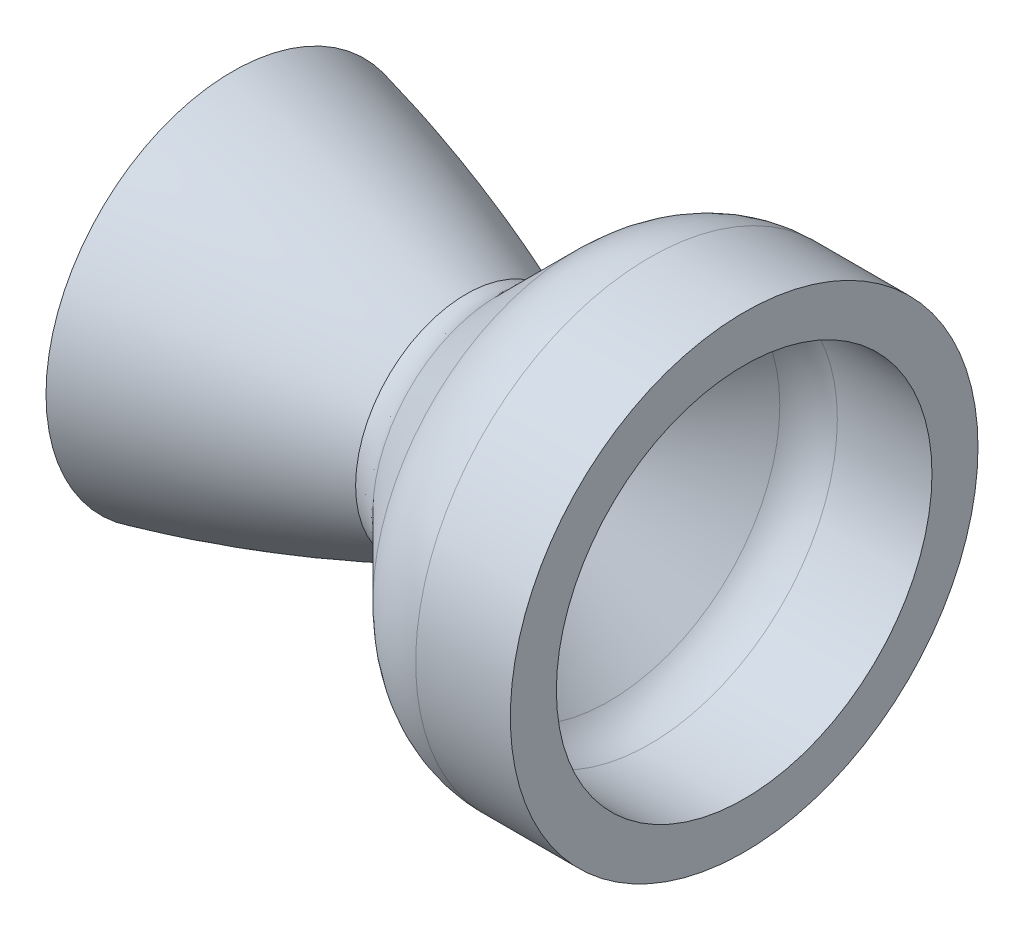
ISO-10303-21;
HEADER;
FILE_DESCRIPTION(('STEP AP214'),'2;1');
FILE_NAME('part.step','',(''),(''),'','','');
FILE_SCHEMA(('AUTOMOTIVE_DESIGN { 1 0 10303 214 1 1 1 1 }'));
ENDSEC;
DATA;
#1=APPLICATION_CONTEXT('core data for automotive mechanical design processes');
#2=APPLICATION_PROTOCOL_DEFINITION('international standard','automotive_design',2000,#1);
#3=PRODUCT_CONTEXT('',#1,'mechanical');
#4=PRODUCT('Part','Part','',(#3));
#5=PRODUCT_RELATED_PRODUCT_CATEGORY('part','',(#4));
#6=PRODUCT_DEFINITION_FORMATION('','',#4);
#7=PRODUCT_DEFINITION_CONTEXT('part definition',#1,'design');
#8=PRODUCT_DEFINITION('design','',#6,#7);
#9=PRODUCT_DEFINITION_SHAPE('','',#8);
#10=(LENGTH_UNIT() NAMED_UNIT(*) SI_UNIT(.MILLI.,.METRE.));
#11=(NAMED_UNIT(*) PLANE_ANGLE_UNIT() SI_UNIT($,.RADIAN.));
#12=(NAMED_UNIT(*) SI_UNIT($,.STERADIAN.) SOLID_ANGLE_UNIT());
#13=UNCERTAINTY_MEASURE_WITH_UNIT(LENGTH_MEASURE(1.E-05),#10,'distance_accuracy_value','');
#14=(GEOMETRIC_REPRESENTATION_CONTEXT(3) GLOBAL_UNCERTAINTY_ASSIGNED_CONTEXT((#13)) GLOBAL_UNIT_ASSIGNED_CONTEXT((#10,
#11,#12)) REPRESENTATION_CONTEXT('',''));
#15=CARTESIAN_POINT('',(0.,0.,0.));
#16=DIRECTION('',(0.,0.,1.));
#17=DIRECTION('',(1.,0.,0.));
#18=AXIS2_PLACEMENT_3D('',#15,#16,#17);
#19=CARTESIAN_POINT('',(1.66197017655065,0.,0.));
#20=DIRECTION('',(1.,0.,0.));
#21=DIRECTION('',(0.,0.,-1.));
#22=AXIS2_PLACEMENT_3D('',#19,#20,#21);
#23=TOROIDAL_SURFACE('',#22,28.,8.8);
#24=CARTESIAN_POINT('',(2.34769354517619,0.,0.));
#25=DIRECTION('',(1.,0.,0.));
#26=DIRECTION('',(0.,0.,-1.));
#27=AXIS2_PLACEMENT_3D('',#24,#25,#26);
#28=CIRCLE('',#27,19.2267575286146);
#29=CARTESIAN_POINT('',(2.34769354517619,0.,-19.2267575286146));
#30=VERTEX_POINT('',#29);
#31=EDGE_CURVE('E10',#30,#30,#28,.T.);
#32=ORIENTED_EDGE('',*,*,#31,.T.);
#33=EDGE_LOOP('',(#32));
#34=FACE_BOUND('',#33,.T.);
#35=CARTESIAN_POINT('',(7.88450985099228,0.,0.));
#36=DIRECTION('',(1.,0.,0.));
#37=DIRECTION('',(0.,0.,-1.));
#38=AXIS2_PLACEMENT_3D('',#35,#36,#37);
#39=CIRCLE('',#38,21.7774603255584);
#40=CARTESIAN_POINT('',(7.88450985099228,0.,-21.7774603255584));
#41=VERTEX_POINT('',#40);
#42=EDGE_CURVE('E82',#41,#41,#39,.T.);
#43=ORIENTED_EDGE('',*,*,#42,.F.);
#44=EDGE_LOOP('',(#43));
#45=FACE_BOUND('',#44,.T.);
#46=ADVANCED_FACE('F39',(#34,#45),#23,.F.);
#47=CARTESIAN_POINT('',(2.34769354517619,19.2267575286146,0.));
#48=CARTESIAN_POINT('',(-17.8144735559307,27.6575846832073,0.));
#49=CARTESIAN_POINT('',(-38.2840579839368,32.421778232158,0.));
#50=B_SPLINE_CURVE_WITH_KNOTS('',2,(#47,#48,#49),.UNSPECIFIED.,.F.,.F.,(3,3),
(0.0185026946429705,1.),.UNSPECIFIED.);
#51=CARTESIAN_POINT('',(0.,0.,0.));
#52=DIRECTION('',(1.,0.,0.));
#53=AXIS1_PLACEMENT('',#51,#52);
#54=SURFACE_OF_REVOLUTION('',#50,#53);
#55=CARTESIAN_POINT('',(-38.2840579839368,0.,0.));
#56=DIRECTION('',(1.,0.,0.));
#57=DIRECTION('',(0.,0.,-1.));
#58=AXIS2_PLACEMENT_3D('',#55,#56,#57);
#59=CIRCLE('',#58,32.421778232158);
#60=CARTESIAN_POINT('',(-38.2840579839368,0.,-32.421778232158));
#61=VERTEX_POINT('',#60);
#62=EDGE_CURVE('E45',#61,#61,#59,.T.);
#63=ORIENTED_EDGE('',*,*,#62,.T.);
#64=EDGE_LOOP('',(#63));
#65=FACE_BOUND('',#64,.T.);
#66=ORIENTED_EDGE('',*,*,#31,.F.);
#67=EDGE_LOOP('',(#66));
#68=FACE_BOUND('',#67,.T.);
#69=ADVANCED_FACE('F105',(#65,#68),#54,.F.);
#70=CARTESIAN_POINT('',(-40.0966047493326,0.,0.));
#71=DIRECTION('',(1.,0.,0.));
#72=DIRECTION('',(0.,0.,-1.));
#73=AXIS2_PLACEMENT_3D('',#70,#71,#72);
#74=CONICAL_SURFACE('',#73,24.629816077267,1.34224337238869);
#75=ORIENTED_EDGE('',*,*,#62,.F.);
#76=EDGE_LOOP('',(#75));
#77=FACE_BOUND('',#76,.T.);
#78=CARTESIAN_POINT('',(-40.0966047493326,0.,0.));
#79=DIRECTION('',(1.,0.,0.));
#80=DIRECTION('',(0.,0.,-1.));
#81=AXIS2_PLACEMENT_3D('',#78,#79,#80);
#82=CIRCLE('',#81,24.629816077267);
#83=CARTESIAN_POINT('',(-40.0966047493326,0.,-24.629816077267));
#84=VERTEX_POINT('',#83);
#85=EDGE_CURVE('E49',#84,#84,#82,.T.);
#86=ORIENTED_EDGE('',*,*,#85,.T.);
#87=EDGE_LOOP('',(#86));
#88=FACE_BOUND('',#87,.T.);
#89=ADVANCED_FACE('F101',(#77,#88),#74,.T.);
#90=CARTESIAN_POINT('',(0.,11.5359944282385,0.));
#91=CARTESIAN_POINT('',(-19.9351691874844,19.9399133176101,0.));
#92=CARTESIAN_POINT('',(-40.0966047493326,24.629816077267,0.));
#93=B_SPLINE_CURVE_WITH_KNOTS('',2,(#90,#91,#92),.UNSPECIFIED.,.F.,.F.,(3,3),(0.,1.),.UNSPECIFIED.);
#94=CARTESIAN_POINT('',(0.,0.,0.));
#95=DIRECTION('',(1.,0.,0.));
#96=AXIS1_PLACEMENT('',#94,#95);
#97=SURFACE_OF_REVOLUTION('',#93,#96);
#98=ORIENTED_EDGE('',*,*,#85,.F.);
#99=EDGE_LOOP('',(#98));
#100=FACE_BOUND('',#99,.T.);
#101=CARTESIAN_POINT('',(0.,0.,0.));
#102=DIRECTION('',(1.,0.,0.));
#103=DIRECTION('',(0.,0.,-1.));
#104=AXIS2_PLACEMENT_3D('',#101,#102,#103);
#105=CIRCLE('',#104,11.5359944282385);
#106=CARTESIAN_POINT('',(0.,0.,-11.5359944282385));
#107=VERTEX_POINT('',#106);
#108=EDGE_CURVE('E53',#107,#107,#105,.T.);
#109=ORIENTED_EDGE('',*,*,#108,.T.);
#110=EDGE_LOOP('',(#109));
#111=FACE_BOUND('',#110,.T.);
#112=ADVANCED_FACE('F96',(#100,#111),#97,.T.);
#113=CARTESIAN_POINT('',(1.66197017655065,0.,0.));
#114=DIRECTION('',(1.,0.,0.));
#115=DIRECTION('',(0.,0.,-1.));
#116=AXIS2_PLACEMENT_3D('',#113,#114,#115);
#117=TOROIDAL_SURFACE('',#116,15.4784,4.2784);
#118=ORIENTED_EDGE('',*,*,#108,.F.);
#119=EDGE_LOOP('',(#118));
#120=FACE_BOUND('',#119,.T.);
#121=CARTESIAN_POINT('',(1.66197017655066,0.,0.));
#122=DIRECTION('',(1.,0.,0.));
#123=DIRECTION('',(0.,0.,-1.));
#124=AXIS2_PLACEMENT_3D('',#121,#122,#123);
#125=CIRCLE('',#124,11.2);
#126=CARTESIAN_POINT('',(1.66197017655066,0.,-11.2));
#127=VERTEX_POINT('',#126);
#128=EDGE_CURVE('E58',#127,#127,#125,.T.);
#129=ORIENTED_EDGE('',*,*,#128,.T.);
#130=EDGE_LOOP('',(#129));
#131=FACE_BOUND('',#130,.T.);
#132=ADVANCED_FACE('F100',(#120,#131),#117,.T.);
#133=CARTESIAN_POINT('',(1.66197017655066,0.,0.));
#134=DIRECTION('',(1.,0.,0.));
#135=DIRECTION('',(0.,0.,-1.));
#136=AXIS2_PLACEMENT_3D('',#133,#134,#135);
#137=TOROIDAL_SURFACE('',#136,28.,16.8);
#138=ORIENTED_EDGE('',*,*,#128,.F.);
#139=EDGE_LOOP('',(#138));
#140=FACE_BOUND('',#139,.T.);
#141=CARTESIAN_POINT('',(13.5413641004847,0.,0.));
#142=DIRECTION('',(1.,0.,0.));
#143=DIRECTION('',(0.,0.,-1.));
#144=AXIS2_PLACEMENT_3D('',#141,#142,#143);
#145=CIRCLE('',#144,16.120606076066);
#146=CARTESIAN_POINT('',(13.5413641004847,0.,-16.120606076066));
#147=VERTEX_POINT('',#146);
#148=EDGE_CURVE('E61',#147,#147,#145,.T.);
#149=ORIENTED_EDGE('',*,*,#148,.T.);
#150=EDGE_LOOP('',(#149));
#151=FACE_BOUND('',#150,.T.);
#152=ADVANCED_FACE('F155',(#140,#151),#137,.T.);
#153=CARTESIAN_POINT('',(27.1451564474177,0.,0.));
#154=DIRECTION('',(1.,0.,0.));
#155=DIRECTION('',(0.,0.,-1.));
#156=AXIS2_PLACEMENT_3D('',#153,#154,#155);
#157=CONICAL_SURFACE('',#156,29.7243984229991,0.78539816339745);
#158=ORIENTED_EDGE('',*,*,#148,.F.);
#159=EDGE_LOOP('',(#158));
#160=FACE_BOUND('',#159,.T.);
#161=CARTESIAN_POINT('',(27.1451564474177,0.,0.));
#162=DIRECTION('',(1.,0.,0.));
#163=DIRECTION('',(0.,0.,-1.));
#164=AXIS2_PLACEMENT_3D('',#161,#162,#163);
#165=CIRCLE('',#164,29.7243984229991);
#166=CARTESIAN_POINT('',(27.1451564474177,0.,-29.7243984229991));
#167=VERTEX_POINT('',#166);
#168=EDGE_CURVE('E64',#167,#167,#165,.T.);
#169=ORIENTED_EDGE('',*,*,#168,.T.);
#170=EDGE_LOOP('',(#169));
#171=FACE_BOUND('',#170,.T.);
#172=ADVANCED_FACE('F149',(#160,#171),#157,.F.);
#173=CARTESIAN_POINT('',(34.2162242592832,0.,0.));
#174=DIRECTION('',(1.,0.,0.));
#175=DIRECTION('',(0.,0.,-1.));
#176=AXIS2_PLACEMENT_3D('',#173,#174,#175);
#177=TOROIDAL_SURFACE('',#176,22.6533306111337,10.);
#178=ORIENTED_EDGE('',*,*,#168,.F.);
#179=EDGE_LOOP('',(#178));
#180=FACE_BOUND('',#179,.T.);
#181=CARTESIAN_POINT('',(34.2162242592832,0.,0.));
#182=DIRECTION('',(1.,0.,0.));
#183=DIRECTION('',(0.,0.,-1.));
#184=AXIS2_PLACEMENT_3D('',#181,#182,#183);
#185=CIRCLE('',#184,32.6533306111337);
#186=CARTESIAN_POINT('',(34.2162242592832,0.,-32.6533306111337));
#187=VERTEX_POINT('',#186);
#188=EDGE_CURVE('E67',#187,#187,#185,.T.);
#189=ORIENTED_EDGE('',*,*,#188,.T.);
#190=EDGE_LOOP('',(#189));
#191=FACE_BOUND('',#190,.T.);
#192=ADVANCED_FACE('F143',(#180,#191),#177,.F.);
#193=CARTESIAN_POINT('',(0.,0.,0.));
#194=DIRECTION('',(1.,0.,0.));
#195=DIRECTION('',(0.,0.,-1.));
#196=AXIS2_PLACEMENT_3D('',#193,#194,#195);
#197=CYLINDRICAL_SURFACE('',#196,32.6533306111337);
#198=ORIENTED_EDGE('',*,*,#188,.F.);
#199=EDGE_LOOP('',(#198));
#200=FACE_BOUND('',#199,.T.);
#201=CARTESIAN_POINT('',(50.6745682121236,0.,0.));
#202=DIRECTION('',(1.,0.,0.));
#203=DIRECTION('',(0.,0.,-1.));
#204=AXIS2_PLACEMENT_3D('',#201,#202,#203);
#205=CIRCLE('',#204,32.6533306111337);
#206=CARTESIAN_POINT('',(50.6745682121236,0.,-32.6533306111337));
#207=VERTEX_POINT('',#206);
#208=EDGE_CURVE('E70',#207,#207,#205,.T.);
#209=ORIENTED_EDGE('',*,*,#208,.T.);
#210=EDGE_LOOP('',(#209));
#211=FACE_BOUND('',#210,.T.);
#212=ADVANCED_FACE('F138',(#200,#211),#197,.F.);
#213=CARTESIAN_POINT('',(50.6745682121236,0.,0.));
#214=DIRECTION('',(1.,0.,0.));
#215=DIRECTION('',(0.,0.,-1.));
#216=AXIS2_PLACEMENT_3D('',#213,#214,#215);
#217=PLANE('',#216);
#218=CARTESIAN_POINT('',(50.6745682121236,0.,0.));
#219=DIRECTION('',(1.,0.,0.));
#220=DIRECTION('',(0.,0.,-1.));
#221=AXIS2_PLACEMENT_3D('',#218,#219,#220);
#222=CIRCLE('',#221,40.6533306111337);
#223=CARTESIAN_POINT('',(50.6745682121236,0.,-40.6533306111337));
#224=VERTEX_POINT('',#223);
#225=EDGE_CURVE('E73',#224,#224,#222,.T.);
#226=ORIENTED_EDGE('',*,*,#225,.T.);
#227=EDGE_LOOP('',(#226));
#228=FACE_BOUND('',#227,.T.);
#229=ORIENTED_EDGE('',*,*,#208,.F.);
#230=EDGE_LOOP('',(#229));
#231=FACE_BOUND('',#230,.T.);
#232=ADVANCED_FACE('F132',(#228,#231),#217,.T.);
#233=CARTESIAN_POINT('',(0.,0.,0.));
#234=DIRECTION('',(1.,0.,0.));
#235=DIRECTION('',(0.,0.,-1.));
#236=AXIS2_PLACEMENT_3D('',#233,#234,#235);
#237=CYLINDRICAL_SURFACE('',#236,40.6533306111337);
#238=CARTESIAN_POINT('',(34.2162242592832,0.,0.));
#239=DIRECTION('',(1.,0.,0.));
#240=DIRECTION('',(0.,0.,-1.));
#241=AXIS2_PLACEMENT_3D('',#238,#239,#240);
#242=CIRCLE('',#241,40.6533306111337);
#243=CARTESIAN_POINT('',(34.2162242592832,0.,-40.6533306111337));
#244=VERTEX_POINT('',#243);
#245=EDGE_CURVE('E76',#244,#244,#242,.T.);
#246=ORIENTED_EDGE('',*,*,#245,.T.);
#247=EDGE_LOOP('',(#246));
#248=FACE_BOUND('',#247,.T.);
#249=ORIENTED_EDGE('',*,*,#225,.F.);
#250=EDGE_LOOP('',(#249));
#251=FACE_BOUND('',#250,.T.);
#252=ADVANCED_FACE('F126',(#248,#251),#237,.T.);
#253=CARTESIAN_POINT('',(34.2162242592832,0.,0.));
#254=DIRECTION('',(1.,0.,0.));
#255=DIRECTION('',(0.,0.,-1.));
#256=AXIS2_PLACEMENT_3D('',#253,#254,#255);
#257=TOROIDAL_SURFACE('',#256,22.6533306111337,18.);
#258=CARTESIAN_POINT('',(21.4883021979253,0.,0.));
#259=DIRECTION('',(1.,0.,0.));
#260=DIRECTION('',(0.,0.,-1.));
#261=AXIS2_PLACEMENT_3D('',#258,#259,#260);
#262=CIRCLE('',#261,35.3812526724915);
#263=CARTESIAN_POINT('',(21.4883021979253,0.,-35.3812526724915));
#264=VERTEX_POINT('',#263);
#265=EDGE_CURVE('E79',#264,#264,#262,.T.);
#266=ORIENTED_EDGE('',*,*,#265,.T.);
#267=EDGE_LOOP('',(#266));
#268=FACE_BOUND('',#267,.T.);
#269=ORIENTED_EDGE('',*,*,#245,.F.);
#270=EDGE_LOOP('',(#269));
#271=FACE_BOUND('',#270,.T.);
#272=ADVANCED_FACE('F120',(#268,#271),#257,.T.);
#273=CARTESIAN_POINT('',(21.4883021979253,0.,0.));
#274=DIRECTION('',(1.,0.,0.));
#275=DIRECTION('',(0.,0.,-1.));
#276=AXIS2_PLACEMENT_3D('',#273,#274,#275);
#277=CONICAL_SURFACE('',#276,35.3812526724915,0.78539816339745);
#278=ORIENTED_EDGE('',*,*,#42,.T.);
#279=EDGE_LOOP('',(#278));
#280=FACE_BOUND('',#279,.T.);
#281=ORIENTED_EDGE('',*,*,#265,.F.);
#282=EDGE_LOOP('',(#281));
#283=FACE_BOUND('',#282,.T.);
#284=ADVANCED_FACE('F117',(#280,#283),#277,.T.);
#285=CLOSED_SHELL('',(#46,#69,#89,#112,#132,#152,#172,#192,#212,#232,#252,#272,#284));
#286=MANIFOLD_SOLID_BREP('B2',#285);
#287=ADVANCED_BREP_SHAPE_REPRESENTATION('',(#18,#286),#14);
#288=SHAPE_DEFINITION_REPRESENTATION(#9,#287);
ENDSEC;
END-ISO-10303-21;
